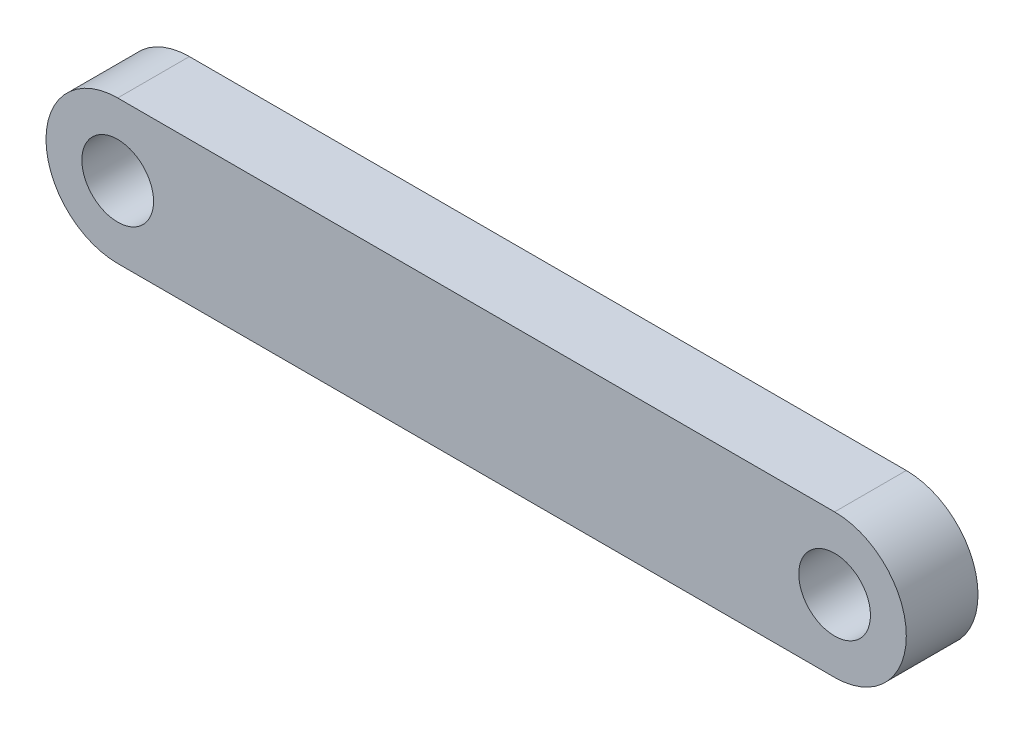
ISO-10303-21;
HEADER;
FILE_DESCRIPTION(('STEP AP214'),'2;1');
FILE_NAME('part.step','',(''),(''),'','','');
FILE_SCHEMA(('AUTOMOTIVE_DESIGN { 1 0 10303 214 1 1 1 1 }'));
ENDSEC;
DATA;
#1=APPLICATION_CONTEXT('core data for automotive mechanical design processes');
#2=APPLICATION_PROTOCOL_DEFINITION('international standard','automotive_design',2000,#1);
#3=PRODUCT_CONTEXT('',#1,'mechanical');
#4=PRODUCT('Part','Part','',(#3));
#5=PRODUCT_RELATED_PRODUCT_CATEGORY('part','',(#4));
#6=PRODUCT_DEFINITION_FORMATION('','',#4);
#7=PRODUCT_DEFINITION_CONTEXT('part definition',#1,'design');
#8=PRODUCT_DEFINITION('design','',#6,#7);
#9=PRODUCT_DEFINITION_SHAPE('','',#8);
#10=(LENGTH_UNIT() NAMED_UNIT(*) SI_UNIT(.MILLI.,.METRE.));
#11=(NAMED_UNIT(*) PLANE_ANGLE_UNIT() SI_UNIT($,.RADIAN.));
#12=(NAMED_UNIT(*) SI_UNIT($,.STERADIAN.) SOLID_ANGLE_UNIT());
#13=UNCERTAINTY_MEASURE_WITH_UNIT(LENGTH_MEASURE(1.E-05),#10,'distance_accuracy_value','');
#14=(GEOMETRIC_REPRESENTATION_CONTEXT(3) GLOBAL_UNCERTAINTY_ASSIGNED_CONTEXT((#13)) GLOBAL_UNIT_ASSIGNED_CONTEXT((#10,
#11,#12)) REPRESENTATION_CONTEXT('',''));
#15=CARTESIAN_POINT('',(0.,0.,0.));
#16=DIRECTION('',(0.,0.,1.));
#17=DIRECTION('',(1.,0.,0.));
#18=AXIS2_PLACEMENT_3D('',#15,#16,#17);
#19=CARTESIAN_POINT('',(-15.,0.,3.));
#20=DIRECTION('',(0.,0.,1.));
#21=DIRECTION('',(1.,0.,0.));
#22=AXIS2_PLACEMENT_3D('',#19,#20,#21);
#23=PLANE('',#22);
#24=CARTESIAN_POINT('',(15.,0.,3.));
#25=DIRECTION('',(0.,0.,1.));
#26=DIRECTION('',(1.,0.,0.));
#27=AXIS2_PLACEMENT_3D('',#24,#25,#26);
#28=CIRCLE('',#27,1.5);
#29=CARTESIAN_POINT('',(16.5,0.,3.));
#30=VERTEX_POINT('',#29);
#31=EDGE_CURVE('E108',#30,#30,#28,.T.);
#32=ORIENTED_EDGE('',*,*,#31,.F.);
#33=EDGE_LOOP('',(#32));
#34=FACE_BOUND('',#33,.T.);
#35=CARTESIAN_POINT('',(-15.,0.,3.));
#36=DIRECTION('',(0.,0.,1.));
#37=DIRECTION('',(1.,0.,0.));
#38=AXIS2_PLACEMENT_3D('',#35,#36,#37);
#39=CIRCLE('',#38,3.);
#40=CARTESIAN_POINT('',(-15.,3.,3.));
#41=VERTEX_POINT('',#40);
#42=CARTESIAN_POINT('',(-15.,-3.,3.));
#43=VERTEX_POINT('',#42);
#44=EDGE_CURVE('E93',#41,#43,#39,.T.);
#45=ORIENTED_EDGE('',*,*,#44,.T.);
#46=DIRECTION('',(1.,0.,0.));
#47=VECTOR('',#46,1.);
#48=CARTESIAN_POINT('',(-15.,-3.,3.));
#49=LINE('',#48,#47);
#50=CARTESIAN_POINT('',(15.,-2.99999999999999,3.));
#51=VERTEX_POINT('',#50);
#52=EDGE_CURVE('E88',#43,#51,#49,.T.);
#53=ORIENTED_EDGE('',*,*,#52,.T.);
#54=CARTESIAN_POINT('',(15.,0.,3.));
#55=DIRECTION('',(0.,0.,1.));
#56=DIRECTION('',(1.,0.,0.));
#57=AXIS2_PLACEMENT_3D('',#54,#55,#56);
#58=CIRCLE('',#57,3.);
#59=CARTESIAN_POINT('',(15.,3.,3.));
#60=VERTEX_POINT('',#59);
#61=EDGE_CURVE('E91',#51,#60,#58,.T.);
#62=ORIENTED_EDGE('',*,*,#61,.T.);
#63=DIRECTION('',(-1.,0.,0.));
#64=VECTOR('',#63,1.);
#65=CARTESIAN_POINT('',(-15.,3.,3.));
#66=LINE('',#65,#64);
#67=EDGE_CURVE('E58',#60,#41,#66,.T.);
#68=ORIENTED_EDGE('',*,*,#67,.T.);
#69=EDGE_LOOP('',(#45,#53,#62,#68));
#70=FACE_BOUND('',#69,.T.);
#71=CARTESIAN_POINT('',(-15.,0.,3.));
#72=DIRECTION('',(0.,0.,1.));
#73=DIRECTION('',(1.,0.,0.));
#74=AXIS2_PLACEMENT_3D('',#71,#72,#73);
#75=CIRCLE('',#74,1.5);
#76=CARTESIAN_POINT('',(-13.5,0.,3.));
#77=VERTEX_POINT('',#76);
#78=EDGE_CURVE('E123',#77,#77,#75,.T.);
#79=ORIENTED_EDGE('',*,*,#78,.F.);
#80=EDGE_LOOP('',(#79));
#81=FACE_BOUND('',#80,.T.);
#82=ADVANCED_FACE('F41',(#34,#70,#81),#23,.T.);
#83=CARTESIAN_POINT('',(-15.,0.,0.));
#84=DIRECTION('',(0.,0.,1.));
#85=DIRECTION('',(1.,0.,0.));
#86=AXIS2_PLACEMENT_3D('',#83,#84,#85);
#87=PLANE('',#86);
#88=CARTESIAN_POINT('',(-15.,0.,0.));
#89=DIRECTION('',(0.,0.,1.));
#90=DIRECTION('',(1.,0.,0.));
#91=AXIS2_PLACEMENT_3D('',#88,#89,#90);
#92=CIRCLE('',#91,3.);
#93=CARTESIAN_POINT('',(-15.,3.,0.));
#94=VERTEX_POINT('',#93);
#95=CARTESIAN_POINT('',(-15.,-3.,0.));
#96=VERTEX_POINT('',#95);
#97=EDGE_CURVE('E105',#94,#96,#92,.T.);
#98=ORIENTED_EDGE('',*,*,#97,.F.);
#99=DIRECTION('',(-1.,0.,0.));
#100=VECTOR('',#99,1.);
#101=CARTESIAN_POINT('',(-15.,3.,0.));
#102=LINE('',#101,#100);
#103=CARTESIAN_POINT('',(15.,3.,0.));
#104=VERTEX_POINT('',#103);
#105=EDGE_CURVE('E81',#104,#94,#102,.T.);
#106=ORIENTED_EDGE('',*,*,#105,.F.);
#107=CARTESIAN_POINT('',(15.,0.,0.));
#108=DIRECTION('',(0.,0.,1.));
#109=DIRECTION('',(1.,0.,0.));
#110=AXIS2_PLACEMENT_3D('',#107,#108,#109);
#111=CIRCLE('',#110,3.);
#112=CARTESIAN_POINT('',(15.,-2.99999999999999,0.));
#113=VERTEX_POINT('',#112);
#114=EDGE_CURVE('E75',#113,#104,#111,.T.);
#115=ORIENTED_EDGE('',*,*,#114,.F.);
#116=DIRECTION('',(1.,0.,0.));
#117=VECTOR('',#116,1.);
#118=CARTESIAN_POINT('',(-15.,-3.,0.));
#119=LINE('',#118,#117);
#120=EDGE_CURVE('E97',#96,#113,#119,.T.);
#121=ORIENTED_EDGE('',*,*,#120,.F.);
#122=EDGE_LOOP('',(#98,#106,#115,#121));
#123=FACE_BOUND('',#122,.T.);
#124=CARTESIAN_POINT('',(15.,0.,0.));
#125=DIRECTION('',(0.,0.,1.));
#126=DIRECTION('',(1.,0.,0.));
#127=AXIS2_PLACEMENT_3D('',#124,#125,#126);
#128=CIRCLE('',#127,1.5);
#129=CARTESIAN_POINT('',(16.5,0.,0.));
#130=VERTEX_POINT('',#129);
#131=EDGE_CURVE('E120',#130,#130,#128,.T.);
#132=ORIENTED_EDGE('',*,*,#131,.T.);
#133=EDGE_LOOP('',(#132));
#134=FACE_BOUND('',#133,.T.);
#135=CARTESIAN_POINT('',(-15.,0.,0.));
#136=DIRECTION('',(0.,0.,1.));
#137=DIRECTION('',(1.,0.,0.));
#138=AXIS2_PLACEMENT_3D('',#135,#136,#137);
#139=CIRCLE('',#138,1.5);
#140=CARTESIAN_POINT('',(-13.5,0.,0.));
#141=VERTEX_POINT('',#140);
#142=EDGE_CURVE('E126',#141,#141,#139,.T.);
#143=ORIENTED_EDGE('',*,*,#142,.T.);
#144=EDGE_LOOP('',(#143));
#145=FACE_BOUND('',#144,.T.);
#146=ADVANCED_FACE('F116',(#123,#134,#145),#87,.F.);
#147=CARTESIAN_POINT('',(-15.,0.,3.));
#148=DIRECTION('',(0.,0.,-1.));
#149=DIRECTION('',(-1.,0.,0.));
#150=AXIS2_PLACEMENT_3D('',#147,#148,#149);
#151=CYLINDRICAL_SURFACE('',#150,3.);
#152=ORIENTED_EDGE('',*,*,#97,.T.);
#153=DIRECTION('',(0.,0.,-1.));
#154=VECTOR('',#153,1.);
#155=CARTESIAN_POINT('',(-15.,-3.,3.));
#156=LINE('',#155,#154);
#157=EDGE_CURVE('E11',#43,#96,#156,.T.);
#158=ORIENTED_EDGE('',*,*,#157,.F.);
#159=ORIENTED_EDGE('',*,*,#44,.F.);
#160=DIRECTION('',(0.,0.,-1.));
#161=VECTOR('',#160,1.);
#162=CARTESIAN_POINT('',(-15.,3.,3.));
#163=LINE('',#162,#161);
#164=EDGE_CURVE('E101',#41,#94,#163,.T.);
#165=ORIENTED_EDGE('',*,*,#164,.T.);
#166=EDGE_LOOP('',(#152,#158,#159,#165));
#167=FACE_BOUND('',#166,.T.);
#168=ADVANCED_FACE('F43',(#167),#151,.T.);
#169=CARTESIAN_POINT('',(-15.,-3.,3.));
#170=DIRECTION('',(0.,1.,0.));
#171=DIRECTION('',(0.,0.,1.));
#172=AXIS2_PLACEMENT_3D('',#169,#170,#171);
#173=PLANE('',#172);
#174=ORIENTED_EDGE('',*,*,#120,.T.);
#175=DIRECTION('',(0.,0.,-1.));
#176=VECTOR('',#175,1.);
#177=CARTESIAN_POINT('',(15.,-2.99999999999999,3.));
#178=LINE('',#177,#176);
#179=EDGE_CURVE('E50',#51,#113,#178,.T.);
#180=ORIENTED_EDGE('',*,*,#179,.F.);
#181=ORIENTED_EDGE('',*,*,#52,.F.);
#182=ORIENTED_EDGE('',*,*,#157,.T.);
#183=EDGE_LOOP('',(#174,#180,#181,#182));
#184=FACE_BOUND('',#183,.T.);
#185=ADVANCED_FACE('F96',(#184),#173,.F.);
#186=CARTESIAN_POINT('',(15.,0.,3.));
#187=DIRECTION('',(0.,0.,-1.));
#188=DIRECTION('',(-1.,0.,0.));
#189=AXIS2_PLACEMENT_3D('',#186,#187,#188);
#190=CYLINDRICAL_SURFACE('',#189,3.);
#191=ORIENTED_EDGE('',*,*,#114,.T.);
#192=DIRECTION('',(0.,0.,-1.));
#193=VECTOR('',#192,1.);
#194=CARTESIAN_POINT('',(15.,3.,3.));
#195=LINE('',#194,#193);
#196=EDGE_CURVE('E98',#60,#104,#195,.T.);
#197=ORIENTED_EDGE('',*,*,#196,.F.);
#198=ORIENTED_EDGE('',*,*,#61,.F.);
#199=ORIENTED_EDGE('',*,*,#179,.T.);
#200=EDGE_LOOP('',(#191,#197,#198,#199));
#201=FACE_BOUND('',#200,.T.);
#202=ADVANCED_FACE('F99',(#201),#190,.T.);
#203=CARTESIAN_POINT('',(-15.,3.,3.));
#204=DIRECTION('',(0.,-1.,0.));
#205=DIRECTION('',(0.,0.,-1.));
#206=AXIS2_PLACEMENT_3D('',#203,#204,#205);
#207=PLANE('',#206);
#208=ORIENTED_EDGE('',*,*,#105,.T.);
#209=ORIENTED_EDGE('',*,*,#164,.F.);
#210=ORIENTED_EDGE('',*,*,#67,.F.);
#211=ORIENTED_EDGE('',*,*,#196,.T.);
#212=EDGE_LOOP('',(#208,#209,#210,#211));
#213=FACE_BOUND('',#212,.T.);
#214=ADVANCED_FACE('F113',(#213),#207,.F.);
#215=CARTESIAN_POINT('',(15.,0.,3.));
#216=DIRECTION('',(0.,0.,-1.));
#217=DIRECTION('',(-1.,0.,0.));
#218=AXIS2_PLACEMENT_3D('',#215,#216,#217);
#219=CYLINDRICAL_SURFACE('',#218,1.5);
#220=ORIENTED_EDGE('',*,*,#31,.T.);
#221=EDGE_LOOP('',(#220));
#222=FACE_BOUND('',#221,.T.);
#223=ORIENTED_EDGE('',*,*,#131,.F.);
#224=EDGE_LOOP('',(#223));
#225=FACE_BOUND('',#224,.T.);
#226=ADVANCED_FACE('F143',(#222,#225),#219,.F.);
#227=CARTESIAN_POINT('',(-15.,0.,3.));
#228=DIRECTION('',(0.,0.,-1.));
#229=DIRECTION('',(-1.,0.,0.));
#230=AXIS2_PLACEMENT_3D('',#227,#228,#229);
#231=CYLINDRICAL_SURFACE('',#230,1.5);
#232=ORIENTED_EDGE('',*,*,#78,.T.);
#233=EDGE_LOOP('',(#232));
#234=FACE_BOUND('',#233,.T.);
#235=ORIENTED_EDGE('',*,*,#142,.F.);
#236=EDGE_LOOP('',(#235));
#237=FACE_BOUND('',#236,.T.);
#238=ADVANCED_FACE('F132',(#234,#237),#231,.F.);
#239=CLOSED_SHELL('',(#82,#146,#168,#185,#202,#214,#226,#238));
#240=MANIFOLD_SOLID_BREP('B2',#239);
#241=ADVANCED_BREP_SHAPE_REPRESENTATION('',(#18,#240),#14);
#242=SHAPE_DEFINITION_REPRESENTATION(#9,#241);
ENDSEC;
END-ISO-10303-21;
